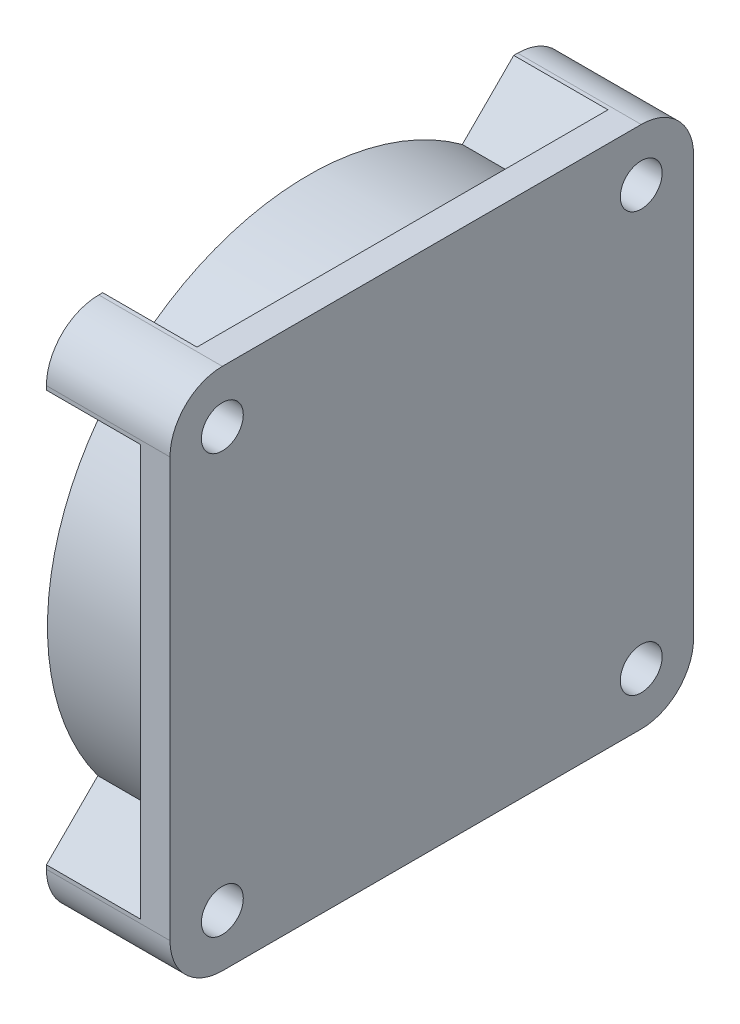
ISO-10303-21;
HEADER;
FILE_DESCRIPTION(('STEP AP214'),'2;1');
FILE_NAME('part.step','',(''),(''),'','','');
FILE_SCHEMA(('AUTOMOTIVE_DESIGN { 1 0 10303 214 1 1 1 1 }'));
ENDSEC;
DATA;
#1=APPLICATION_CONTEXT('core data for automotive mechanical design processes');
#2=APPLICATION_PROTOCOL_DEFINITION('international standard','automotive_design',2000,#1);
#3=PRODUCT_CONTEXT('',#1,'mechanical');
#4=PRODUCT('Part','Part','',(#3));
#5=PRODUCT_RELATED_PRODUCT_CATEGORY('part','',(#4));
#6=PRODUCT_DEFINITION_FORMATION('','',#4);
#7=PRODUCT_DEFINITION_CONTEXT('part definition',#1,'design');
#8=PRODUCT_DEFINITION('design','',#6,#7);
#9=PRODUCT_DEFINITION_SHAPE('','',#8);
#10=(LENGTH_UNIT() NAMED_UNIT(*) SI_UNIT(.MILLI.,.METRE.));
#11=(NAMED_UNIT(*) PLANE_ANGLE_UNIT() SI_UNIT($,.RADIAN.));
#12=(NAMED_UNIT(*) SI_UNIT($,.STERADIAN.) SOLID_ANGLE_UNIT());
#13=UNCERTAINTY_MEASURE_WITH_UNIT(LENGTH_MEASURE(1.E-05),#10,'distance_accuracy_value','');
#14=(GEOMETRIC_REPRESENTATION_CONTEXT(3) GLOBAL_UNCERTAINTY_ASSIGNED_CONTEXT((#13)) GLOBAL_UNIT_ASSIGNED_CONTEXT((#10,
#11,#12)) REPRESENTATION_CONTEXT('',''));
#15=CARTESIAN_POINT('',(0.,0.,0.));
#16=DIRECTION('',(0.,0.,1.));
#17=DIRECTION('',(1.,0.,0.));
#18=AXIS2_PLACEMENT_3D('',#15,#16,#17);
#19=CARTESIAN_POINT('',(11.8,-20.,20.));
#20=DIRECTION('',(-1.,0.,0.));
#21=DIRECTION('',(0.,0.,1.));
#22=AXIS2_PLACEMENT_3D('',#19,#20,#21);
#23=CYLINDRICAL_SURFACE('',#22,2.);
#24=CARTESIAN_POINT('',(11.8,-20.,20.));
#25=DIRECTION('',(1.,0.,0.));
#26=DIRECTION('',(0.,0.,-1.));
#27=AXIS2_PLACEMENT_3D('',#24,#25,#26);
#28=CIRCLE('',#27,2.);
#29=CARTESIAN_POINT('',(11.8,-20.,18.));
#30=VERTEX_POINT('',#29);
#31=EDGE_CURVE('E314',#30,#30,#28,.T.);
#32=ORIENTED_EDGE('',*,*,#31,.T.);
#33=EDGE_LOOP('',(#32));
#34=FACE_BOUND('',#33,.T.);
#35=CARTESIAN_POINT('',(1.5,-20.,20.));
#36=DIRECTION('',(-1.,0.,0.));
#37=DIRECTION('',(0.,0.,1.));
#38=AXIS2_PLACEMENT_3D('',#35,#36,#37);
#39=CIRCLE('',#38,2.);
#40=CARTESIAN_POINT('',(1.5,-20.,22.));
#41=VERTEX_POINT('',#40);
#42=EDGE_CURVE('E47',#41,#41,#39,.T.);
#43=ORIENTED_EDGE('',*,*,#42,.T.);
#44=EDGE_LOOP('',(#43));
#45=FACE_BOUND('',#44,.T.);
#46=ADVANCED_FACE('F43',(#34,#45),#23,.F.);
#47=CARTESIAN_POINT('',(11.8,20.0000000000001,19.9999999999999));
#48=DIRECTION('',(-1.,0.,0.));
#49=DIRECTION('',(0.,0.,1.));
#50=AXIS2_PLACEMENT_3D('',#47,#48,#49);
#51=CYLINDRICAL_SURFACE('',#50,2.00000000000001);
#52=CARTESIAN_POINT('',(11.8,20.0000000000001,19.9999999999999));
#53=DIRECTION('',(1.,0.,0.));
#54=DIRECTION('',(0.,0.,-1.));
#55=AXIS2_PLACEMENT_3D('',#52,#53,#54);
#56=CIRCLE('',#55,2.00000000000001);
#57=CARTESIAN_POINT('',(11.8,20.0000000000001,17.9999999999999));
#58=VERTEX_POINT('',#57);
#59=EDGE_CURVE('E306',#58,#58,#56,.T.);
#60=ORIENTED_EDGE('',*,*,#59,.T.);
#61=EDGE_LOOP('',(#60));
#62=FACE_BOUND('',#61,.T.);
#63=CARTESIAN_POINT('',(1.5,20.0000000000001,19.9999999999999));
#64=DIRECTION('',(-1.,0.,0.));
#65=DIRECTION('',(0.,0.,1.));
#66=AXIS2_PLACEMENT_3D('',#63,#64,#65);
#67=CIRCLE('',#66,2.00000000000001);
#68=CARTESIAN_POINT('',(1.5,20.0000000000001,21.9999999999999));
#69=VERTEX_POINT('',#68);
#70=EDGE_CURVE('E292',#69,#69,#67,.T.);
#71=ORIENTED_EDGE('',*,*,#70,.T.);
#72=EDGE_LOOP('',(#71));
#73=FACE_BOUND('',#72,.T.);
#74=ADVANCED_FACE('F439',(#62,#73),#51,.F.);
#75=CARTESIAN_POINT('',(11.8,19.9999999999999,-20.0000000000001));
#76=DIRECTION('',(-1.,0.,0.));
#77=DIRECTION('',(0.,0.,1.));
#78=AXIS2_PLACEMENT_3D('',#75,#76,#77);
#79=CYLINDRICAL_SURFACE('',#78,2.00000000000001);
#80=CARTESIAN_POINT('',(11.8,19.9999999999999,-20.0000000000001));
#81=DIRECTION('',(1.,0.,0.));
#82=DIRECTION('',(0.,0.,-1.));
#83=AXIS2_PLACEMENT_3D('',#80,#81,#82);
#84=CIRCLE('',#83,2.00000000000001);
#85=CARTESIAN_POINT('',(11.8,19.9999999999999,-22.0000000000002));
#86=VERTEX_POINT('',#85);
#87=EDGE_CURVE('E301',#86,#86,#84,.T.);
#88=ORIENTED_EDGE('',*,*,#87,.T.);
#89=EDGE_LOOP('',(#88));
#90=FACE_BOUND('',#89,.T.);
#91=CARTESIAN_POINT('',(1.5,19.9999999999999,-20.0000000000001));
#92=DIRECTION('',(-1.,0.,0.));
#93=DIRECTION('',(0.,0.,1.));
#94=AXIS2_PLACEMENT_3D('',#91,#92,#93);
#95=CIRCLE('',#94,2.00000000000001);
#96=CARTESIAN_POINT('',(1.5,19.9999999999999,-18.0000000000001));
#97=VERTEX_POINT('',#96);
#98=EDGE_CURVE('E289',#97,#97,#95,.T.);
#99=ORIENTED_EDGE('',*,*,#98,.T.);
#100=EDGE_LOOP('',(#99));
#101=FACE_BOUND('',#100,.T.);
#102=ADVANCED_FACE('F446',(#90,#101),#79,.F.);
#103=CARTESIAN_POINT('',(11.8,-20.0000000000002,-19.9999999999998));
#104=DIRECTION('',(-1.,0.,0.));
#105=DIRECTION('',(0.,0.,1.));
#106=AXIS2_PLACEMENT_3D('',#103,#104,#105);
#107=CYLINDRICAL_SURFACE('',#106,2.);
#108=CARTESIAN_POINT('',(11.8,-20.0000000000002,-19.9999999999998));
#109=DIRECTION('',(1.,0.,0.));
#110=DIRECTION('',(0.,0.,-1.));
#111=AXIS2_PLACEMENT_3D('',#108,#109,#110);
#112=CIRCLE('',#111,2.);
#113=CARTESIAN_POINT('',(11.8,-20.0000000000002,-21.9999999999998));
#114=VERTEX_POINT('',#113);
#115=EDGE_CURVE('E297',#114,#114,#112,.T.);
#116=ORIENTED_EDGE('',*,*,#115,.T.);
#117=EDGE_LOOP('',(#116));
#118=FACE_BOUND('',#117,.T.);
#119=CARTESIAN_POINT('',(1.5,-20.0000000000002,-19.9999999999998));
#120=DIRECTION('',(-1.,0.,0.));
#121=DIRECTION('',(0.,0.,1.));
#122=AXIS2_PLACEMENT_3D('',#119,#120,#121);
#123=CIRCLE('',#122,2.);
#124=CARTESIAN_POINT('',(1.5,-20.0000000000002,-17.9999999999998));
#125=VERTEX_POINT('',#124);
#126=EDGE_CURVE('E286',#125,#125,#123,.T.);
#127=ORIENTED_EDGE('',*,*,#126,.T.);
#128=EDGE_LOOP('',(#127));
#129=FACE_BOUND('',#128,.T.);
#130=ADVANCED_FACE('F435',(#118,#129),#107,.F.);
#131=CARTESIAN_POINT('',(11.8,0.,0.));
#132=DIRECTION('',(-1.,0.,0.));
#133=DIRECTION('',(0.,0.,1.));
#134=AXIS2_PLACEMENT_3D('',#131,#132,#133);
#135=PLANE('',#134);
#136=DIRECTION('',(0.,1.,0.));
#137=VECTOR('',#136,1.);
#138=CARTESIAN_POINT('',(11.8,-25.,-25.));
#139=LINE('',#138,#137);
#140=CARTESIAN_POINT('',(11.8,-20.,-25.));
#141=VERTEX_POINT('',#140);
#142=CARTESIAN_POINT('',(11.8,20.,-25.));
#143=VERTEX_POINT('',#142);
#144=EDGE_CURVE('E250',#141,#143,#139,.T.);
#145=ORIENTED_EDGE('',*,*,#144,.T.);
#146=CARTESIAN_POINT('',(11.8,20.,-20.));
#147=DIRECTION('',(-1.,0.,0.));
#148=DIRECTION('',(0.,0.,1.));
#149=AXIS2_PLACEMENT_3D('',#146,#147,#148);
#150=CIRCLE('',#149,5.);
#151=CARTESIAN_POINT('',(11.8,25.,-20.));
#152=VERTEX_POINT('',#151);
#153=EDGE_CURVE('E277',#143,#152,#150,.F.);
#154=ORIENTED_EDGE('',*,*,#153,.T.);
#155=DIRECTION('',(0.,0.,1.));
#156=VECTOR('',#155,1.);
#157=CARTESIAN_POINT('',(11.8,25.,25.));
#158=LINE('',#157,#156);
#159=CARTESIAN_POINT('',(11.8,25.,20.));
#160=VERTEX_POINT('',#159);
#161=EDGE_CURVE('E320',#152,#160,#158,.T.);
#162=ORIENTED_EDGE('',*,*,#161,.T.);
#163=CARTESIAN_POINT('',(11.8,20.,20.));
#164=DIRECTION('',(-1.,0.,0.));
#165=DIRECTION('',(0.,0.,1.));
#166=AXIS2_PLACEMENT_3D('',#163,#164,#165);
#167=CIRCLE('',#166,5.);
#168=CARTESIAN_POINT('',(11.8,20.,25.));
#169=VERTEX_POINT('',#168);
#170=EDGE_CURVE('E271',#160,#169,#167,.F.);
#171=ORIENTED_EDGE('',*,*,#170,.T.);
#172=DIRECTION('',(0.,-1.,0.));
#173=VECTOR('',#172,1.);
#174=CARTESIAN_POINT('',(11.8,-25.,25.));
#175=LINE('',#174,#173);
#176=CARTESIAN_POINT('',(11.8,-20.,25.));
#177=VERTEX_POINT('',#176);
#178=EDGE_CURVE('E323',#169,#177,#175,.T.);
#179=ORIENTED_EDGE('',*,*,#178,.T.);
#180=CARTESIAN_POINT('',(11.8,-20.,20.));
#181=DIRECTION('',(-1.,0.,0.));
#182=DIRECTION('',(0.,0.,1.));
#183=AXIS2_PLACEMENT_3D('',#180,#181,#182);
#184=CIRCLE('',#183,5.);
#185=CARTESIAN_POINT('',(11.8,-25.,20.));
#186=VERTEX_POINT('',#185);
#187=EDGE_CURVE('E273',#177,#186,#184,.F.);
#188=ORIENTED_EDGE('',*,*,#187,.T.);
#189=DIRECTION('',(0.,0.,-1.));
#190=VECTOR('',#189,1.);
#191=CARTESIAN_POINT('',(11.8,-25.,25.));
#192=LINE('',#191,#190);
#193=CARTESIAN_POINT('',(11.8,-25.,-20.));
#194=VERTEX_POINT('',#193);
#195=EDGE_CURVE('E253',#186,#194,#192,.T.);
#196=ORIENTED_EDGE('',*,*,#195,.T.);
#197=CARTESIAN_POINT('',(11.8,-20.,-20.));
#198=DIRECTION('',(-1.,0.,0.));
#199=DIRECTION('',(0.,0.,1.));
#200=AXIS2_PLACEMENT_3D('',#197,#198,#199);
#201=CIRCLE('',#200,5.);
#202=EDGE_CURVE('E275',#194,#141,#201,.F.);
#203=ORIENTED_EDGE('',*,*,#202,.T.);
#204=EDGE_LOOP('',(#145,#154,#162,#171,#179,#188,#196,#203));
#205=FACE_BOUND('',#204,.T.);
#206=ORIENTED_EDGE('',*,*,#31,.F.);
#207=EDGE_LOOP('',(#206));
#208=FACE_BOUND('',#207,.T.);
#209=ORIENTED_EDGE('',*,*,#59,.F.);
#210=EDGE_LOOP('',(#209));
#211=FACE_BOUND('',#210,.T.);
#212=ORIENTED_EDGE('',*,*,#87,.F.);
#213=EDGE_LOOP('',(#212));
#214=FACE_BOUND('',#213,.T.);
#215=ORIENTED_EDGE('',*,*,#115,.F.);
#216=EDGE_LOOP('',(#215));
#217=FACE_BOUND('',#216,.T.);
#218=ADVANCED_FACE('F329',(#205,#208,#211,#214,#217),#135,.F.);
#219=CARTESIAN_POINT('',(0.,0.,0.));
#220=DIRECTION('',(-1.,0.,0.));
#221=DIRECTION('',(0.,0.,1.));
#222=AXIS2_PLACEMENT_3D('',#219,#220,#221);
#223=PLANE('',#222);
#224=DIRECTION('',(0.,0.707106781186556,0.707106781186538));
#225=VECTOR('',#224,1.);
#226=CARTESIAN_POINT('',(0.,25.,19.6259884629817));
#227=LINE('',#226,#225);
#228=CARTESIAN_POINT('',(0.,20.0877241444842,14.7137126074661));
#229=VERTEX_POINT('',#228);
#230=CARTESIAN_POINT('',(0.,25.,19.6259884629817));
#231=VERTEX_POINT('',#230);
#232=EDGE_CURVE('E218',#229,#231,#227,.T.);
#233=ORIENTED_EDGE('',*,*,#232,.F.);
#234=CARTESIAN_POINT('',(0.,0.,0.));
#235=DIRECTION('',(1.,0.,0.));
#236=DIRECTION('',(0.,0.,1.));
#237=AXIS2_PLACEMENT_3D('',#234,#235,#236);
#238=CIRCLE('',#237,24.9);
#239=CARTESIAN_POINT('',(0.,20.0877241444839,-14.7137126074665));
#240=VERTEX_POINT('',#239);
#241=EDGE_CURVE('E228',#240,#229,#238,.T.);
#242=ORIENTED_EDGE('',*,*,#241,.F.);
#243=DIRECTION('',(0.,-0.70710678118654,0.707106781186555));
#244=VECTOR('',#243,1.);
#245=CARTESIAN_POINT('',(0.,25.,-19.6259884629828));
#246=LINE('',#245,#244);
#247=CARTESIAN_POINT('',(0.,25.,-19.6259884629828));
#248=VERTEX_POINT('',#247);
#249=EDGE_CURVE('E209',#248,#240,#246,.T.);
#250=ORIENTED_EDGE('',*,*,#249,.F.);
#251=DIRECTION('',(0.,0.,1.));
#252=VECTOR('',#251,1.);
#253=CARTESIAN_POINT('',(0.,25.,25.));
#254=LINE('',#253,#252);
#255=CARTESIAN_POINT('',(0.,25.,-20.));
#256=VERTEX_POINT('',#255);
#257=EDGE_CURVE('E226',#256,#248,#254,.T.);
#258=ORIENTED_EDGE('',*,*,#257,.F.);
#259=CARTESIAN_POINT('',(0.,20.,-20.));
#260=DIRECTION('',(-1.,0.,0.));
#261=DIRECTION('',(0.,0.,1.));
#262=AXIS2_PLACEMENT_3D('',#259,#260,#261);
#263=CIRCLE('',#262,5.);
#264=CARTESIAN_POINT('',(0.,20.,-25.));
#265=VERTEX_POINT('',#264);
#266=EDGE_CURVE('E264',#256,#265,#263,.T.);
#267=ORIENTED_EDGE('',*,*,#266,.T.);
#268=DIRECTION('',(0.,1.,0.));
#269=VECTOR('',#268,1.);
#270=CARTESIAN_POINT('',(0.,-25.,-25.));
#271=LINE('',#270,#269);
#272=CARTESIAN_POINT('',(0.,19.6259884629817,-25.));
#273=VERTEX_POINT('',#272);
#274=EDGE_CURVE('E317',#273,#265,#271,.T.);
#275=ORIENTED_EDGE('',*,*,#274,.F.);
#276=DIRECTION('',(0.,0.707106781186539,-0.707106781186556));
#277=VECTOR('',#276,1.);
#278=CARTESIAN_POINT('',(0.,19.6259884629817,-25.));
#279=LINE('',#278,#277);
#280=CARTESIAN_POINT('',(0.,14.7137126074661,-20.0877241444842));
#281=VERTEX_POINT('',#280);
#282=EDGE_CURVE('E566',#281,#273,#279,.T.);
#283=ORIENTED_EDGE('',*,*,#282,.F.);
#284=CARTESIAN_POINT('',(0.,0.,0.));
#285=DIRECTION('',(1.,0.,0.));
#286=DIRECTION('',(0.,0.,1.));
#287=AXIS2_PLACEMENT_3D('',#284,#285,#286);
#288=CIRCLE('',#287,24.9);
#289=CARTESIAN_POINT('',(0.,-14.7137126074665,-20.0877241444839));
#290=VERTEX_POINT('',#289);
#291=EDGE_CURVE('E574',#290,#281,#288,.T.);
#292=ORIENTED_EDGE('',*,*,#291,.F.);
#293=DIRECTION('',(0.,0.707106781186556,0.707106781186539));
#294=VECTOR('',#293,1.);
#295=CARTESIAN_POINT('',(0.,-19.6259884629828,-25.));
#296=LINE('',#295,#294);
#297=CARTESIAN_POINT('',(0.,-19.6259884629828,-25.));
#298=VERTEX_POINT('',#297);
#299=EDGE_CURVE('E229',#298,#290,#296,.T.);
#300=ORIENTED_EDGE('',*,*,#299,.F.);
#301=CARTESIAN_POINT('',(0.,-20.,-25.));
#302=VERTEX_POINT('',#301);
#303=EDGE_CURVE('E241',#302,#298,#271,.T.);
#304=ORIENTED_EDGE('',*,*,#303,.F.);
#305=CARTESIAN_POINT('',(0.,-20.,-20.));
#306=DIRECTION('',(-1.,0.,0.));
#307=DIRECTION('',(0.,0.,1.));
#308=AXIS2_PLACEMENT_3D('',#305,#306,#307);
#309=CIRCLE('',#308,5.);
#310=CARTESIAN_POINT('',(0.,-25.,-20.));
#311=VERTEX_POINT('',#310);
#312=EDGE_CURVE('E261',#302,#311,#309,.T.);
#313=ORIENTED_EDGE('',*,*,#312,.T.);
#314=DIRECTION('',(0.,0.,-1.));
#315=VECTOR('',#314,1.);
#316=CARTESIAN_POINT('',(0.,-25.,25.));
#317=LINE('',#316,#315);
#318=CARTESIAN_POINT('',(0.,-25.,-19.6259884629817));
#319=VERTEX_POINT('',#318);
#320=EDGE_CURVE('E246',#319,#311,#317,.T.);
#321=ORIENTED_EDGE('',*,*,#320,.F.);
#322=DIRECTION('',(0.,-0.707106781186556,-0.70710678118654));
#323=VECTOR('',#322,1.);
#324=CARTESIAN_POINT('',(0.,-25.,-19.6259884629817));
#325=LINE('',#324,#323);
#326=CARTESIAN_POINT('',(0.,-20.0877241444842,-14.7137126074661));
#327=VERTEX_POINT('',#326);
#328=EDGE_CURVE('E382',#327,#319,#325,.T.);
#329=ORIENTED_EDGE('',*,*,#328,.F.);
#330=CARTESIAN_POINT('',(0.,0.,0.));
#331=DIRECTION('',(1.,0.,0.));
#332=DIRECTION('',(0.,0.,1.));
#333=AXIS2_PLACEMENT_3D('',#330,#331,#332);
#334=CIRCLE('',#333,24.9);
#335=CARTESIAN_POINT('',(0.,-20.0877241444839,14.7137126074665));
#336=VERTEX_POINT('',#335);
#337=EDGE_CURVE('E379',#336,#327,#334,.T.);
#338=ORIENTED_EDGE('',*,*,#337,.F.);
#339=DIRECTION('',(0.,0.70710678118654,-0.707106781186555));
#340=VECTOR('',#339,1.);
#341=CARTESIAN_POINT('',(0.,-25.,19.6259884629828));
#342=LINE('',#341,#340);
#343=CARTESIAN_POINT('',(0.,-25.,19.6259884629828));
#344=VERTEX_POINT('',#343);
#345=EDGE_CURVE('E376',#344,#336,#342,.T.);
#346=ORIENTED_EDGE('',*,*,#345,.F.);
#347=CARTESIAN_POINT('',(0.,-25.,20.));
#348=VERTEX_POINT('',#347);
#349=EDGE_CURVE('E247',#348,#344,#317,.T.);
#350=ORIENTED_EDGE('',*,*,#349,.F.);
#351=CARTESIAN_POINT('',(0.,-20.,20.));
#352=DIRECTION('',(-1.,0.,0.));
#353=DIRECTION('',(0.,0.,1.));
#354=AXIS2_PLACEMENT_3D('',#351,#352,#353);
#355=CIRCLE('',#354,5.);
#356=CARTESIAN_POINT('',(0.,-20.,25.));
#357=VERTEX_POINT('',#356);
#358=EDGE_CURVE('E258',#348,#357,#355,.T.);
#359=ORIENTED_EDGE('',*,*,#358,.T.);
#360=DIRECTION('',(0.,-1.,0.));
#361=VECTOR('',#360,1.);
#362=CARTESIAN_POINT('',(0.,-25.,25.));
#363=LINE('',#362,#361);
#364=CARTESIAN_POINT('',(0.,-19.6259884629817,25.));
#365=VERTEX_POINT('',#364);
#366=EDGE_CURVE('E236',#365,#357,#363,.T.);
#367=ORIENTED_EDGE('',*,*,#366,.F.);
#368=DIRECTION('',(0.,-0.707106781186539,0.707106781186556));
#369=VECTOR('',#368,1.);
#370=CARTESIAN_POINT('',(0.,-19.6259884629817,25.));
#371=LINE('',#370,#369);
#372=CARTESIAN_POINT('',(0.,-14.7137126074661,20.0877241444842));
#373=VERTEX_POINT('',#372);
#374=EDGE_CURVE('E586',#373,#365,#371,.T.);
#375=ORIENTED_EDGE('',*,*,#374,.F.);
#376=CARTESIAN_POINT('',(0.,0.,0.));
#377=DIRECTION('',(1.,0.,0.));
#378=DIRECTION('',(0.,0.,1.));
#379=AXIS2_PLACEMENT_3D('',#376,#377,#378);
#380=CIRCLE('',#379,24.9);
#381=CARTESIAN_POINT('',(0.,14.7137126074665,20.0877241444839));
#382=VERTEX_POINT('',#381);
#383=EDGE_CURVE('E595',#382,#373,#380,.T.);
#384=ORIENTED_EDGE('',*,*,#383,.F.);
#385=DIRECTION('',(0.,-0.707106781186555,-0.70710678118654));
#386=VECTOR('',#385,1.);
#387=CARTESIAN_POINT('',(0.,19.6259884629828,25.));
#388=LINE('',#387,#386);
#389=CARTESIAN_POINT('',(0.,19.6259884629828,25.));
#390=VERTEX_POINT('',#389);
#391=EDGE_CURVE('E563',#390,#382,#388,.T.);
#392=ORIENTED_EDGE('',*,*,#391,.F.);
#393=CARTESIAN_POINT('',(0.,20.,25.));
#394=VERTEX_POINT('',#393);
#395=EDGE_CURVE('E239',#394,#390,#363,.T.);
#396=ORIENTED_EDGE('',*,*,#395,.F.);
#397=CARTESIAN_POINT('',(0.,20.,20.));
#398=DIRECTION('',(-1.,0.,0.));
#399=DIRECTION('',(0.,0.,1.));
#400=AXIS2_PLACEMENT_3D('',#397,#398,#399);
#401=CIRCLE('',#400,5.);
#402=CARTESIAN_POINT('',(0.,25.,20.));
#403=VERTEX_POINT('',#402);
#404=EDGE_CURVE('E255',#394,#403,#401,.T.);
#405=ORIENTED_EDGE('',*,*,#404,.T.);
#406=EDGE_CURVE('E237',#231,#403,#254,.T.);
#407=ORIENTED_EDGE('',*,*,#406,.F.);
#408=EDGE_LOOP('',(#233,#242,#250,#258,#267,#275,#283,#292,#300,#304,#313,#321,#329,#338,#346,
#350,#359,#367,#375,#384,#392,#396,#405,#407));
#409=FACE_BOUND('',#408,.T.);
#410=CARTESIAN_POINT('',(0.,-20.,20.));
#411=DIRECTION('',(-1.,0.,0.));
#412=DIRECTION('',(0.,0.,1.));
#413=AXIS2_PLACEMENT_3D('',#410,#411,#412);
#414=CIRCLE('',#413,3.05);
#415=CARTESIAN_POINT('',(0.,-20.,23.05));
#416=VERTEX_POINT('',#415);
#417=EDGE_CURVE('E414',#416,#416,#414,.T.);
#418=ORIENTED_EDGE('',*,*,#417,.F.);
#419=EDGE_LOOP('',(#418));
#420=FACE_BOUND('',#419,.T.);
#421=CARTESIAN_POINT('',(0.,20.0000000000001,19.9999999999999));
#422=DIRECTION('',(-1.,0.,0.));
#423=DIRECTION('',(0.,0.,1.));
#424=AXIS2_PLACEMENT_3D('',#421,#422,#423);
#425=CIRCLE('',#424,3.05);
#426=CARTESIAN_POINT('',(0.,20.0000000000001,23.0499999999999));
#427=VERTEX_POINT('',#426);
#428=EDGE_CURVE('E408',#427,#427,#425,.T.);
#429=ORIENTED_EDGE('',*,*,#428,.F.);
#430=EDGE_LOOP('',(#429));
#431=FACE_BOUND('',#430,.T.);
#432=CARTESIAN_POINT('',(0.,19.9999999999998,-20.0000000000002));
#433=DIRECTION('',(-1.,0.,0.));
#434=DIRECTION('',(0.,0.,1.));
#435=AXIS2_PLACEMENT_3D('',#432,#433,#434);
#436=CIRCLE('',#435,3.05000000000001);
#437=CARTESIAN_POINT('',(0.,19.9999999999998,-16.9500000000001));
#438=VERTEX_POINT('',#437);
#439=EDGE_CURVE('E402',#438,#438,#436,.T.);
#440=ORIENTED_EDGE('',*,*,#439,.F.);
#441=EDGE_LOOP('',(#440));
#442=FACE_BOUND('',#441,.T.);
#443=CARTESIAN_POINT('',(0.,-20.0000000000002,-19.9999999999998));
#444=DIRECTION('',(-1.,0.,0.));
#445=DIRECTION('',(0.,0.,1.));
#446=AXIS2_PLACEMENT_3D('',#443,#444,#445);
#447=CIRCLE('',#446,3.05);
#448=CARTESIAN_POINT('',(0.,-20.0000000000002,-16.9499999999998));
#449=VERTEX_POINT('',#448);
#450=EDGE_CURVE('E309',#449,#449,#447,.T.);
#451=ORIENTED_EDGE('',*,*,#450,.F.);
#452=EDGE_LOOP('',(#451));
#453=FACE_BOUND('',#452,.T.);
#454=ADVANCED_FACE('F223',(#409,#420,#431,#442,#453),#223,.T.);
#455=CARTESIAN_POINT('',(11.8,-25.,-25.));
#456=DIRECTION('',(0.,0.,1.));
#457=DIRECTION('',(1.,0.,0.));
#458=AXIS2_PLACEMENT_3D('',#455,#456,#457);
#459=PLANE('',#458);
#460=DIRECTION('',(0.,1.,0.));
#461=VECTOR('',#460,1.);
#462=CARTESIAN_POINT('',(9.,-19.6259884629828,-25.));
#463=LINE('',#462,#461);
#464=CARTESIAN_POINT('',(9.,-19.6259884629828,-25.));
#465=VERTEX_POINT('',#464);
#466=CARTESIAN_POINT('',(9.,19.6259884629817,-25.));
#467=VERTEX_POINT('',#466);
#468=EDGE_CURVE('E562',#465,#467,#463,.T.);
#469=ORIENTED_EDGE('',*,*,#468,.T.);
#470=DIRECTION('',(-1.,0.,0.));
#471=VECTOR('',#470,1.);
#472=CARTESIAN_POINT('',(51.3581615684695,19.6259884629817,-25.));
#473=LINE('',#472,#471);
#474=EDGE_CURVE('E60',#467,#273,#473,.T.);
#475=ORIENTED_EDGE('',*,*,#474,.T.);
#476=ORIENTED_EDGE('',*,*,#274,.T.);
#477=DIRECTION('',(-1.,0.,0.));
#478=VECTOR('',#477,1.);
#479=CARTESIAN_POINT('',(11.8,20.,-25.));
#480=LINE('',#479,#478);
#481=EDGE_CURVE('E269',#265,#143,#480,.F.);
#482=ORIENTED_EDGE('',*,*,#481,.T.);
#483=ORIENTED_EDGE('',*,*,#144,.F.);
#484=DIRECTION('',(-1.,0.,0.));
#485=VECTOR('',#484,1.);
#486=CARTESIAN_POINT('',(11.8,-20.,-25.));
#487=LINE('',#486,#485);
#488=EDGE_CURVE('E266',#141,#302,#487,.T.);
#489=ORIENTED_EDGE('',*,*,#488,.T.);
#490=ORIENTED_EDGE('',*,*,#303,.T.);
#491=DIRECTION('',(-1.,0.,0.));
#492=VECTOR('',#491,1.);
#493=CARTESIAN_POINT('',(51.3581615684695,-19.6259884629828,-25.));
#494=LINE('',#493,#492);
#495=EDGE_CURVE('E564',#465,#298,#494,.T.);
#496=ORIENTED_EDGE('',*,*,#495,.F.);
#497=EDGE_LOOP('',(#469,#475,#476,#482,#483,#489,#490,#496));
#498=FACE_BOUND('',#497,.T.);
#499=ADVANCED_FACE('F343',(#498),#459,.F.);
#500=CARTESIAN_POINT('',(11.8,25.,25.));
#501=DIRECTION('',(0.,-1.,0.));
#502=DIRECTION('',(0.,0.,-1.));
#503=AXIS2_PLACEMENT_3D('',#500,#501,#502);
#504=PLANE('',#503);
#505=DIRECTION('',(0.,0.,1.));
#506=VECTOR('',#505,1.);
#507=CARTESIAN_POINT('',(9.,25.,-19.6259884629828));
#508=LINE('',#507,#506);
#509=CARTESIAN_POINT('',(9.,25.,-19.6259884629828));
#510=VERTEX_POINT('',#509);
#511=CARTESIAN_POINT('',(9.,25.,19.6259884629817));
#512=VERTEX_POINT('',#511);
#513=EDGE_CURVE('E545',#510,#512,#508,.T.);
#514=ORIENTED_EDGE('',*,*,#513,.T.);
#515=DIRECTION('',(-1.,0.,0.));
#516=VECTOR('',#515,1.);
#517=CARTESIAN_POINT('',(51.3581615684695,25.,19.6259884629817));
#518=LINE('',#517,#516);
#519=EDGE_CURVE('E68',#512,#231,#518,.T.);
#520=ORIENTED_EDGE('',*,*,#519,.T.);
#521=ORIENTED_EDGE('',*,*,#406,.T.);
#522=DIRECTION('',(-1.,0.,0.));
#523=VECTOR('',#522,1.);
#524=CARTESIAN_POINT('',(11.8,25.,20.));
#525=LINE('',#524,#523);
#526=EDGE_CURVE('E251',#403,#160,#525,.F.);
#527=ORIENTED_EDGE('',*,*,#526,.T.);
#528=ORIENTED_EDGE('',*,*,#161,.F.);
#529=DIRECTION('',(-1.,0.,0.));
#530=VECTOR('',#529,1.);
#531=CARTESIAN_POINT('',(11.8,25.,-20.));
#532=LINE('',#531,#530);
#533=EDGE_CURVE('E235',#152,#256,#532,.T.);
#534=ORIENTED_EDGE('',*,*,#533,.T.);
#535=ORIENTED_EDGE('',*,*,#257,.T.);
#536=DIRECTION('',(-1.,0.,0.));
#537=VECTOR('',#536,1.);
#538=CARTESIAN_POINT('',(51.3581615684695,25.,-19.6259884629828));
#539=LINE('',#538,#537);
#540=EDGE_CURVE('E205',#510,#248,#539,.T.);
#541=ORIENTED_EDGE('',*,*,#540,.F.);
#542=EDGE_LOOP('',(#514,#520,#521,#527,#528,#534,#535,#541));
#543=FACE_BOUND('',#542,.T.);
#544=ADVANCED_FACE('F232',(#543),#504,.F.);
#545=CARTESIAN_POINT('',(11.8,-25.,25.));
#546=DIRECTION('',(0.,0.,-1.));
#547=DIRECTION('',(-1.,0.,0.));
#548=AXIS2_PLACEMENT_3D('',#545,#546,#547);
#549=PLANE('',#548);
#550=DIRECTION('',(0.,-1.,0.));
#551=VECTOR('',#550,1.);
#552=CARTESIAN_POINT('',(9.,19.6259884629828,25.));
#553=LINE('',#552,#551);
#554=CARTESIAN_POINT('',(9.,19.6259884629828,25.));
#555=VERTEX_POINT('',#554);
#556=CARTESIAN_POINT('',(9.,-19.6259884629817,25.));
#557=VERTEX_POINT('',#556);
#558=EDGE_CURVE('E583',#555,#557,#553,.T.);
#559=ORIENTED_EDGE('',*,*,#558,.T.);
#560=DIRECTION('',(-1.,0.,0.));
#561=VECTOR('',#560,1.);
#562=CARTESIAN_POINT('',(51.3581615684695,-19.6259884629817,25.));
#563=LINE('',#562,#561);
#564=EDGE_CURVE('E591',#557,#365,#563,.T.);
#565=ORIENTED_EDGE('',*,*,#564,.T.);
#566=ORIENTED_EDGE('',*,*,#366,.T.);
#567=DIRECTION('',(-1.,0.,0.));
#568=VECTOR('',#567,1.);
#569=CARTESIAN_POINT('',(11.8,-20.,25.));
#570=LINE('',#569,#568);
#571=EDGE_CURVE('E12',#357,#177,#570,.F.);
#572=ORIENTED_EDGE('',*,*,#571,.T.);
#573=ORIENTED_EDGE('',*,*,#178,.F.);
#574=DIRECTION('',(-1.,0.,0.));
#575=VECTOR('',#574,1.);
#576=CARTESIAN_POINT('',(11.8,20.,25.));
#577=LINE('',#576,#575);
#578=EDGE_CURVE('E52',#169,#394,#577,.T.);
#579=ORIENTED_EDGE('',*,*,#578,.T.);
#580=ORIENTED_EDGE('',*,*,#395,.T.);
#581=DIRECTION('',(-1.,0.,0.));
#582=VECTOR('',#581,1.);
#583=CARTESIAN_POINT('',(51.3581615684695,19.6259884629828,25.));
#584=LINE('',#583,#582);
#585=EDGE_CURVE('E584',#555,#390,#584,.T.);
#586=ORIENTED_EDGE('',*,*,#585,.F.);
#587=EDGE_LOOP('',(#559,#565,#566,#572,#573,#579,#580,#586));
#588=FACE_BOUND('',#587,.T.);
#589=ADVANCED_FACE('F363',(#588),#549,.F.);
#590=CARTESIAN_POINT('',(11.8,-25.,25.));
#591=DIRECTION('',(0.,1.,0.));
#592=DIRECTION('',(0.,0.,1.));
#593=AXIS2_PLACEMENT_3D('',#590,#591,#592);
#594=PLANE('',#593);
#595=ORIENTED_EDGE('',*,*,#349,.T.);
#596=DIRECTION('',(-1.,0.,0.));
#597=VECTOR('',#596,1.);
#598=CARTESIAN_POINT('',(51.3581615684695,-25.,19.6259884629828));
#599=LINE('',#598,#597);
#600=CARTESIAN_POINT('',(9.,-25.,19.6259884629828));
#601=VERTEX_POINT('',#600);
#602=EDGE_CURVE('E606',#601,#344,#599,.T.);
#603=ORIENTED_EDGE('',*,*,#602,.F.);
#604=DIRECTION('',(0.,0.,-1.));
#605=VECTOR('',#604,1.);
#606=CARTESIAN_POINT('',(9.,-25.,19.6259884629828));
#607=LINE('',#606,#605);
#608=CARTESIAN_POINT('',(9.,-25.,-19.6259884629817));
#609=VERTEX_POINT('',#608);
#610=EDGE_CURVE('E399',#601,#609,#607,.T.);
#611=ORIENTED_EDGE('',*,*,#610,.T.);
#612=DIRECTION('',(-1.,0.,0.));
#613=VECTOR('',#612,1.);
#614=CARTESIAN_POINT('',(51.3581615684695,-25.,-19.6259884629817));
#615=LINE('',#614,#613);
#616=EDGE_CURVE('E386',#609,#319,#615,.T.);
#617=ORIENTED_EDGE('',*,*,#616,.T.);
#618=ORIENTED_EDGE('',*,*,#320,.T.);
#619=DIRECTION('',(-1.,0.,0.));
#620=VECTOR('',#619,1.);
#621=CARTESIAN_POINT('',(11.8,-25.,-20.));
#622=LINE('',#621,#620);
#623=EDGE_CURVE('E282',#311,#194,#622,.F.);
#624=ORIENTED_EDGE('',*,*,#623,.T.);
#625=ORIENTED_EDGE('',*,*,#195,.F.);
#626=DIRECTION('',(-1.,0.,0.));
#627=VECTOR('',#626,1.);
#628=CARTESIAN_POINT('',(11.8,-25.,20.));
#629=LINE('',#628,#627);
#630=EDGE_CURVE('E279',#186,#348,#629,.T.);
#631=ORIENTED_EDGE('',*,*,#630,.T.);
#632=EDGE_LOOP('',(#595,#603,#611,#617,#618,#624,#625,#631));
#633=FACE_BOUND('',#632,.T.);
#634=ADVANCED_FACE('F371',(#633),#594,.F.);
#635=CARTESIAN_POINT('',(11.8,20.,-20.));
#636=DIRECTION('',(-1.,0.,0.));
#637=DIRECTION('',(0.,0.,1.));
#638=AXIS2_PLACEMENT_3D('',#635,#636,#637);
#639=CYLINDRICAL_SURFACE('',#638,5.);
#640=ORIENTED_EDGE('',*,*,#153,.F.);
#641=ORIENTED_EDGE('',*,*,#481,.F.);
#642=ORIENTED_EDGE('',*,*,#266,.F.);
#643=ORIENTED_EDGE('',*,*,#533,.F.);
#644=EDGE_LOOP('',(#640,#641,#642,#643));
#645=FACE_BOUND('',#644,.T.);
#646=ADVANCED_FACE('F354',(#645),#639,.T.);
#647=CARTESIAN_POINT('',(11.8,-20.,-20.));
#648=DIRECTION('',(-1.,0.,0.));
#649=DIRECTION('',(0.,0.,1.));
#650=AXIS2_PLACEMENT_3D('',#647,#648,#649);
#651=CYLINDRICAL_SURFACE('',#650,5.);
#652=ORIENTED_EDGE('',*,*,#202,.F.);
#653=ORIENTED_EDGE('',*,*,#623,.F.);
#654=ORIENTED_EDGE('',*,*,#312,.F.);
#655=ORIENTED_EDGE('',*,*,#488,.F.);
#656=EDGE_LOOP('',(#652,#653,#654,#655));
#657=FACE_BOUND('',#656,.T.);
#658=ADVANCED_FACE('F338',(#657),#651,.T.);
#659=CARTESIAN_POINT('',(11.8,-20.,20.));
#660=DIRECTION('',(-1.,0.,0.));
#661=DIRECTION('',(0.,0.,1.));
#662=AXIS2_PLACEMENT_3D('',#659,#660,#661);
#663=CYLINDRICAL_SURFACE('',#662,5.);
#664=ORIENTED_EDGE('',*,*,#187,.F.);
#665=ORIENTED_EDGE('',*,*,#571,.F.);
#666=ORIENTED_EDGE('',*,*,#358,.F.);
#667=ORIENTED_EDGE('',*,*,#630,.F.);
#668=EDGE_LOOP('',(#664,#665,#666,#667));
#669=FACE_BOUND('',#668,.T.);
#670=ADVANCED_FACE('F369',(#669),#663,.T.);
#671=CARTESIAN_POINT('',(11.8,20.,20.));
#672=DIRECTION('',(-1.,0.,0.));
#673=DIRECTION('',(0.,0.,1.));
#674=AXIS2_PLACEMENT_3D('',#671,#672,#673);
#675=CYLINDRICAL_SURFACE('',#674,5.);
#676=ORIENTED_EDGE('',*,*,#170,.F.);
#677=ORIENTED_EDGE('',*,*,#526,.F.);
#678=ORIENTED_EDGE('',*,*,#404,.F.);
#679=ORIENTED_EDGE('',*,*,#578,.F.);
#680=EDGE_LOOP('',(#676,#677,#678,#679));
#681=FACE_BOUND('',#680,.T.);
#682=ADVANCED_FACE('F45',(#681),#675,.T.);
#683=CARTESIAN_POINT('',(1.5,-20.0000000000002,-19.9999999999998));
#684=DIRECTION('',(-1.,0.,0.));
#685=DIRECTION('',(0.,0.,1.));
#686=AXIS2_PLACEMENT_3D('',#683,#684,#685);
#687=CYLINDRICAL_SURFACE('',#686,3.05);
#688=CARTESIAN_POINT('',(1.5,-20.0000000000002,-19.9999999999998));
#689=DIRECTION('',(-1.,0.,0.));
#690=DIRECTION('',(0.,0.,1.));
#691=AXIS2_PLACEMENT_3D('',#688,#689,#690);
#692=CIRCLE('',#691,3.05);
#693=CARTESIAN_POINT('',(1.5,-20.0000000000002,-16.9499999999998));
#694=VERTEX_POINT('',#693);
#695=EDGE_CURVE('E290',#694,#694,#692,.T.);
#696=ORIENTED_EDGE('',*,*,#695,.F.);
#697=EDGE_LOOP('',(#696));
#698=FACE_BOUND('',#697,.T.);
#699=ORIENTED_EDGE('',*,*,#450,.T.);
#700=EDGE_LOOP('',(#699));
#701=FACE_BOUND('',#700,.T.);
#702=ADVANCED_FACE('F425',(#698,#701),#687,.F.);
#703=CARTESIAN_POINT('',(1.5,-20.0000000000002,-19.9999999999998));
#704=DIRECTION('',(-1.,0.,0.));
#705=DIRECTION('',(0.,0.,1.));
#706=AXIS2_PLACEMENT_3D('',#703,#704,#705);
#707=PLANE('',#706);
#708=ORIENTED_EDGE('',*,*,#126,.F.);
#709=EDGE_LOOP('',(#708));
#710=FACE_BOUND('',#709,.T.);
#711=ORIENTED_EDGE('',*,*,#695,.T.);
#712=EDGE_LOOP('',(#711));
#713=FACE_BOUND('',#712,.T.);
#714=ADVANCED_FACE('F457',(#710,#713),#707,.T.);
#715=CARTESIAN_POINT('',(1.5,19.9999999999998,-20.0000000000002));
#716=DIRECTION('',(-1.,0.,0.));
#717=DIRECTION('',(0.,0.,1.));
#718=AXIS2_PLACEMENT_3D('',#715,#716,#717);
#719=CYLINDRICAL_SURFACE('',#718,3.05000000000001);
#720=CARTESIAN_POINT('',(1.5,19.9999999999998,-20.0000000000002));
#721=DIRECTION('',(-1.,0.,0.));
#722=DIRECTION('',(0.,0.,1.));
#723=AXIS2_PLACEMENT_3D('',#720,#721,#722);
#724=CIRCLE('',#723,3.05000000000001);
#725=CARTESIAN_POINT('',(1.5,19.9999999999998,-16.9500000000001));
#726=VERTEX_POINT('',#725);
#727=EDGE_CURVE('E405',#726,#726,#724,.T.);
#728=ORIENTED_EDGE('',*,*,#727,.F.);
#729=EDGE_LOOP('',(#728));
#730=FACE_BOUND('',#729,.T.);
#731=ORIENTED_EDGE('',*,*,#439,.T.);
#732=EDGE_LOOP('',(#731));
#733=FACE_BOUND('',#732,.T.);
#734=ADVANCED_FACE('F461',(#730,#733),#719,.F.);
#735=CARTESIAN_POINT('',(1.5,19.9999999999998,-20.0000000000002));
#736=DIRECTION('',(-1.,0.,0.));
#737=DIRECTION('',(0.,0.,1.));
#738=AXIS2_PLACEMENT_3D('',#735,#736,#737);
#739=PLANE('',#738);
#740=ORIENTED_EDGE('',*,*,#98,.F.);
#741=EDGE_LOOP('',(#740));
#742=FACE_BOUND('',#741,.T.);
#743=ORIENTED_EDGE('',*,*,#727,.T.);
#744=EDGE_LOOP('',(#743));
#745=FACE_BOUND('',#744,.T.);
#746=ADVANCED_FACE('F478',(#742,#745),#739,.T.);
#747=CARTESIAN_POINT('',(1.5,20.0000000000001,19.9999999999999));
#748=DIRECTION('',(-1.,0.,0.));
#749=DIRECTION('',(0.,0.,1.));
#750=AXIS2_PLACEMENT_3D('',#747,#748,#749);
#751=CYLINDRICAL_SURFACE('',#750,3.05);
#752=CARTESIAN_POINT('',(1.5,20.0000000000001,19.9999999999999));
#753=DIRECTION('',(-1.,0.,0.));
#754=DIRECTION('',(0.,0.,1.));
#755=AXIS2_PLACEMENT_3D('',#752,#753,#754);
#756=CIRCLE('',#755,3.05);
#757=CARTESIAN_POINT('',(1.5,20.0000000000001,23.0499999999999));
#758=VERTEX_POINT('',#757);
#759=EDGE_CURVE('E411',#758,#758,#756,.T.);
#760=ORIENTED_EDGE('',*,*,#759,.F.);
#761=EDGE_LOOP('',(#760));
#762=FACE_BOUND('',#761,.T.);
#763=ORIENTED_EDGE('',*,*,#428,.T.);
#764=EDGE_LOOP('',(#763));
#765=FACE_BOUND('',#764,.T.);
#766=ADVANCED_FACE('F474',(#762,#765),#751,.F.);
#767=CARTESIAN_POINT('',(1.5,20.0000000000001,19.9999999999999));
#768=DIRECTION('',(-1.,0.,0.));
#769=DIRECTION('',(0.,0.,1.));
#770=AXIS2_PLACEMENT_3D('',#767,#768,#769);
#771=PLANE('',#770);
#772=ORIENTED_EDGE('',*,*,#70,.F.);
#773=EDGE_LOOP('',(#772));
#774=FACE_BOUND('',#773,.T.);
#775=ORIENTED_EDGE('',*,*,#759,.T.);
#776=EDGE_LOOP('',(#775));
#777=FACE_BOUND('',#776,.T.);
#778=ADVANCED_FACE('F470',(#774,#777),#771,.T.);
#779=CARTESIAN_POINT('',(1.5,-20.,20.));
#780=DIRECTION('',(-1.,0.,0.));
#781=DIRECTION('',(0.,0.,1.));
#782=AXIS2_PLACEMENT_3D('',#779,#780,#781);
#783=CYLINDRICAL_SURFACE('',#782,3.05);
#784=CARTESIAN_POINT('',(1.5,-20.,20.));
#785=DIRECTION('',(-1.,0.,0.));
#786=DIRECTION('',(0.,0.,1.));
#787=AXIS2_PLACEMENT_3D('',#784,#785,#786);
#788=CIRCLE('',#787,3.05);
#789=CARTESIAN_POINT('',(1.5,-20.,23.05));
#790=VERTEX_POINT('',#789);
#791=EDGE_CURVE('E417',#790,#790,#788,.T.);
#792=ORIENTED_EDGE('',*,*,#791,.F.);
#793=EDGE_LOOP('',(#792));
#794=FACE_BOUND('',#793,.T.);
#795=ORIENTED_EDGE('',*,*,#417,.T.);
#796=EDGE_LOOP('',(#795));
#797=FACE_BOUND('',#796,.T.);
#798=ADVANCED_FACE('F466',(#794,#797),#783,.F.);
#799=CARTESIAN_POINT('',(1.5,-20.,20.));
#800=DIRECTION('',(-1.,0.,0.));
#801=DIRECTION('',(0.,0.,1.));
#802=AXIS2_PLACEMENT_3D('',#799,#800,#801);
#803=PLANE('',#802);
#804=ORIENTED_EDGE('',*,*,#42,.F.);
#805=EDGE_LOOP('',(#804));
#806=FACE_BOUND('',#805,.T.);
#807=ORIENTED_EDGE('',*,*,#791,.T.);
#808=EDGE_LOOP('',(#807));
#809=FACE_BOUND('',#808,.T.);
#810=ADVANCED_FACE('F463',(#806,#809),#803,.T.);
#811=CARTESIAN_POINT('',(51.3581615684695,0.,0.));
#812=DIRECTION('',(-1.,0.,0.));
#813=DIRECTION('',(0.,0.,1.));
#814=AXIS2_PLACEMENT_3D('',#811,#812,#813);
#815=CYLINDRICAL_SURFACE('',#814,24.9);
#816=CARTESIAN_POINT('',(9.,0.,0.));
#817=DIRECTION('',(-1.,0.,0.));
#818=DIRECTION('',(0.,0.,1.));
#819=AXIS2_PLACEMENT_3D('',#816,#817,#818);
#820=CIRCLE('',#819,24.9);
#821=CARTESIAN_POINT('',(9.,-20.0877241444842,-14.7137126074661));
#822=VERTEX_POINT('',#821);
#823=CARTESIAN_POINT('',(9.,-20.0877241444839,14.7137126074665));
#824=VERTEX_POINT('',#823);
#825=EDGE_CURVE('E394',#822,#824,#820,.T.);
#826=ORIENTED_EDGE('',*,*,#825,.T.);
#827=DIRECTION('',(-1.,0.,0.));
#828=VECTOR('',#827,1.);
#829=CARTESIAN_POINT('',(51.3581615684695,-20.0877241444839,14.7137126074665));
#830=LINE('',#829,#828);
#831=EDGE_CURVE('E389',#824,#336,#830,.T.);
#832=ORIENTED_EDGE('',*,*,#831,.T.);
#833=ORIENTED_EDGE('',*,*,#337,.T.);
#834=DIRECTION('',(-1.,0.,0.));
#835=VECTOR('',#834,1.);
#836=CARTESIAN_POINT('',(51.3581615684695,-20.0877241444842,-14.7137126074661));
#837=LINE('',#836,#835);
#838=EDGE_CURVE('E383',#822,#327,#837,.T.);
#839=ORIENTED_EDGE('',*,*,#838,.F.);
#840=EDGE_LOOP('',(#826,#832,#833,#839));
#841=FACE_BOUND('',#840,.T.);
#842=ADVANCED_FACE('F465',(#841),#815,.T.);
#843=CARTESIAN_POINT('',(51.3581615684695,-25.,19.6259884629828));
#844=DIRECTION('',(0.,0.707106781186555,0.70710678118654));
#845=DIRECTION('',(0.,-0.70710678118654,0.707106781186555));
#846=AXIS2_PLACEMENT_3D('',#843,#844,#845);
#847=PLANE('',#846);
#848=DIRECTION('',(0.,-0.70710678118654,0.707106781186555));
#849=VECTOR('',#848,1.);
#850=CARTESIAN_POINT('',(9.,-25.,19.6259884629828));
#851=LINE('',#850,#849);
#852=EDGE_CURVE('E396',#824,#601,#851,.T.);
#853=ORIENTED_EDGE('',*,*,#852,.T.);
#854=ORIENTED_EDGE('',*,*,#602,.T.);
#855=ORIENTED_EDGE('',*,*,#345,.T.);
#856=ORIENTED_EDGE('',*,*,#831,.F.);
#857=EDGE_LOOP('',(#853,#854,#855,#856));
#858=FACE_BOUND('',#857,.T.);
#859=ADVANCED_FACE('F492',(#858),#847,.F.);
#860=CARTESIAN_POINT('',(51.3581615684695,-25.,-19.6259884629817));
#861=DIRECTION('',(0.,0.707106781186539,-0.707106781186555));
#862=DIRECTION('',(0.,0.707106781186556,0.70710678118654));
#863=AXIS2_PLACEMENT_3D('',#860,#861,#862);
#864=PLANE('',#863);
#865=DIRECTION('',(0.,0.707106781186556,0.70710678118654));
#866=VECTOR('',#865,1.);
#867=CARTESIAN_POINT('',(9.,-25.,-19.6259884629817));
#868=LINE('',#867,#866);
#869=EDGE_CURVE('E397',#609,#822,#868,.T.);
#870=ORIENTED_EDGE('',*,*,#869,.T.);
#871=ORIENTED_EDGE('',*,*,#838,.T.);
#872=ORIENTED_EDGE('',*,*,#328,.T.);
#873=ORIENTED_EDGE('',*,*,#616,.F.);
#874=EDGE_LOOP('',(#870,#871,#872,#873));
#875=FACE_BOUND('',#874,.T.);
#876=ADVANCED_FACE('F490',(#875),#864,.F.);
#877=CARTESIAN_POINT('',(9.,0.,0.));
#878=DIRECTION('',(-1.,0.,0.));
#879=DIRECTION('',(0.,0.,1.));
#880=AXIS2_PLACEMENT_3D('',#877,#878,#879);
#881=PLANE('',#880);
#882=ORIENTED_EDGE('',*,*,#825,.F.);
#883=ORIENTED_EDGE('',*,*,#869,.F.);
#884=ORIENTED_EDGE('',*,*,#610,.F.);
#885=ORIENTED_EDGE('',*,*,#852,.F.);
#886=EDGE_LOOP('',(#882,#883,#884,#885));
#887=FACE_BOUND('',#886,.T.);
#888=ADVANCED_FACE('F486',(#887),#881,.T.);
#889=CARTESIAN_POINT('',(51.3581615684695,-19.6259884629817,25.));
#890=DIRECTION('',(0.,-0.707106781186556,-0.707106781186539));
#891=DIRECTION('',(0.,0.707106781186539,-0.707106781186556));
#892=AXIS2_PLACEMENT_3D('',#889,#890,#891);
#893=PLANE('',#892);
#894=DIRECTION('',(0.,0.707106781186539,-0.707106781186556));
#895=VECTOR('',#894,1.);
#896=CARTESIAN_POINT('',(9.,-19.6259884629817,25.));
#897=LINE('',#896,#895);
#898=CARTESIAN_POINT('',(9.,-14.7137126074661,20.0877241444842));
#899=VERTEX_POINT('',#898);
#900=EDGE_CURVE('E601',#557,#899,#897,.T.);
#901=ORIENTED_EDGE('',*,*,#900,.T.);
#902=DIRECTION('',(-1.,0.,0.));
#903=VECTOR('',#902,1.);
#904=CARTESIAN_POINT('',(51.3581615684695,-14.7137126074661,20.0877241444842));
#905=LINE('',#904,#903);
#906=EDGE_CURVE('E589',#899,#373,#905,.T.);
#907=ORIENTED_EDGE('',*,*,#906,.T.);
#908=ORIENTED_EDGE('',*,*,#374,.T.);
#909=ORIENTED_EDGE('',*,*,#564,.F.);
#910=EDGE_LOOP('',(#901,#907,#908,#909));
#911=FACE_BOUND('',#910,.T.);
#912=ADVANCED_FACE('F489',(#911),#893,.F.);
#913=CARTESIAN_POINT('',(51.3581615684695,0.,0.));
#914=DIRECTION('',(-1.,0.,0.));
#915=DIRECTION('',(0.,0.,1.));
#916=AXIS2_PLACEMENT_3D('',#913,#914,#915);
#917=CYLINDRICAL_SURFACE('',#916,24.9);
#918=CARTESIAN_POINT('',(9.,0.,0.));
#919=DIRECTION('',(-1.,0.,0.));
#920=DIRECTION('',(0.,0.,1.));
#921=AXIS2_PLACEMENT_3D('',#918,#919,#920);
#922=CIRCLE('',#921,24.9);
#923=CARTESIAN_POINT('',(9.,14.7137126074665,20.0877241444839));
#924=VERTEX_POINT('',#923);
#925=EDGE_CURVE('E593',#899,#924,#922,.T.);
#926=ORIENTED_EDGE('',*,*,#925,.T.);
#927=DIRECTION('',(-1.,0.,0.));
#928=VECTOR('',#927,1.);
#929=CARTESIAN_POINT('',(51.3581615684695,14.7137126074665,20.0877241444839));
#930=LINE('',#929,#928);
#931=EDGE_CURVE('E587',#924,#382,#930,.T.);
#932=ORIENTED_EDGE('',*,*,#931,.T.);
#933=ORIENTED_EDGE('',*,*,#383,.T.);
#934=ORIENTED_EDGE('',*,*,#906,.F.);
#935=EDGE_LOOP('',(#926,#932,#933,#934));
#936=FACE_BOUND('',#935,.T.);
#937=ADVANCED_FACE('F509',(#936),#917,.T.);
#938=CARTESIAN_POINT('',(51.3581615684695,19.6259884629828,25.));
#939=DIRECTION('',(0.,0.70710678118654,-0.707106781186555));
#940=DIRECTION('',(0.,0.707106781186555,0.70710678118654));
#941=AXIS2_PLACEMENT_3D('',#938,#939,#940);
#942=PLANE('',#941);
#943=DIRECTION('',(0.,0.707106781186555,0.70710678118654));
#944=VECTOR('',#943,1.);
#945=CARTESIAN_POINT('',(9.,19.6259884629828,25.));
#946=LINE('',#945,#944);
#947=EDGE_CURVE('E393',#924,#555,#946,.T.);
#948=ORIENTED_EDGE('',*,*,#947,.T.);
#949=ORIENTED_EDGE('',*,*,#585,.T.);
#950=ORIENTED_EDGE('',*,*,#391,.T.);
#951=ORIENTED_EDGE('',*,*,#931,.F.);
#952=EDGE_LOOP('',(#948,#949,#950,#951));
#953=FACE_BOUND('',#952,.T.);
#954=ADVANCED_FACE('F505',(#953),#942,.F.);
#955=CARTESIAN_POINT('',(9.,0.,0.));
#956=DIRECTION('',(-1.,0.,0.));
#957=DIRECTION('',(0.,0.,1.));
#958=AXIS2_PLACEMENT_3D('',#955,#956,#957);
#959=PLANE('',#958);
#960=ORIENTED_EDGE('',*,*,#558,.F.);
#961=ORIENTED_EDGE('',*,*,#947,.F.);
#962=ORIENTED_EDGE('',*,*,#925,.F.);
#963=ORIENTED_EDGE('',*,*,#900,.F.);
#964=EDGE_LOOP('',(#960,#961,#962,#963));
#965=FACE_BOUND('',#964,.T.);
#966=ADVANCED_FACE('F501',(#965),#959,.T.);
#967=CARTESIAN_POINT('',(51.3581615684695,25.,19.6259884629817));
#968=DIRECTION('',(0.,-0.707106781186539,0.707106781186557));
#969=DIRECTION('',(0.,-0.707106781186557,-0.707106781186539));
#970=AXIS2_PLACEMENT_3D('',#967,#968,#969);
#971=PLANE('',#970);
#972=DIRECTION('',(0.,-0.707106781186557,-0.707106781186539));
#973=VECTOR('',#972,1.);
#974=CARTESIAN_POINT('',(9.,25.,19.6259884629817));
#975=LINE('',#974,#973);
#976=CARTESIAN_POINT('',(9.,20.0877241444842,14.7137126074661));
#977=VERTEX_POINT('',#976);
#978=EDGE_CURVE('E547',#512,#977,#975,.T.);
#979=ORIENTED_EDGE('',*,*,#978,.T.);
#980=DIRECTION('',(-1.,0.,0.));
#981=VECTOR('',#980,1.);
#982=CARTESIAN_POINT('',(51.3581615684695,20.0877241444842,14.7137126074661));
#983=LINE('',#982,#981);
#984=EDGE_CURVE('E557',#977,#229,#983,.T.);
#985=ORIENTED_EDGE('',*,*,#984,.T.);
#986=ORIENTED_EDGE('',*,*,#232,.T.);
#987=ORIENTED_EDGE('',*,*,#519,.F.);
#988=EDGE_LOOP('',(#979,#985,#986,#987));
#989=FACE_BOUND('',#988,.T.);
#990=ADVANCED_FACE('F504',(#989),#971,.F.);
#991=CARTESIAN_POINT('',(51.3581615684695,0.,0.));
#992=DIRECTION('',(-1.,0.,0.));
#993=DIRECTION('',(0.,0.,1.));
#994=AXIS2_PLACEMENT_3D('',#991,#992,#993);
#995=CYLINDRICAL_SURFACE('',#994,24.9);
#996=CARTESIAN_POINT('',(9.,0.,0.));
#997=DIRECTION('',(-1.,0.,0.));
#998=DIRECTION('',(0.,0.,1.));
#999=AXIS2_PLACEMENT_3D('',#996,#997,#998);
#1000=CIRCLE('',#999,24.9);
#1001=CARTESIAN_POINT('',(9.,20.0877241444839,-14.7137126074665));
#1002=VERTEX_POINT('',#1001);
#1003=EDGE_CURVE('E550',#977,#1002,#1000,.T.);
#1004=ORIENTED_EDGE('',*,*,#1003,.T.);
#1005=DIRECTION('',(-1.,0.,0.));
#1006=VECTOR('',#1005,1.);
#1007=CARTESIAN_POINT('',(51.3581615684695,20.0877241444839,-14.7137126074665));
#1008=LINE('',#1007,#1006);
#1009=EDGE_CURVE('E217',#1002,#240,#1008,.T.);
#1010=ORIENTED_EDGE('',*,*,#1009,.T.);
#1011=ORIENTED_EDGE('',*,*,#241,.T.);
#1012=ORIENTED_EDGE('',*,*,#984,.F.);
#1013=EDGE_LOOP('',(#1004,#1010,#1011,#1012));
#1014=FACE_BOUND('',#1013,.T.);
#1015=ADVANCED_FACE('F535',(#1014),#995,.T.);
#1016=CARTESIAN_POINT('',(51.3581615684695,25.,-19.6259884629828));
#1017=DIRECTION('',(0.,-0.707106781186555,-0.70710678118654));
#1018=DIRECTION('',(0.,0.70710678118654,-0.707106781186555));
#1019=AXIS2_PLACEMENT_3D('',#1016,#1017,#1018);
#1020=PLANE('',#1019);
#1021=DIRECTION('',(0.,0.70710678118654,-0.707106781186555));
#1022=VECTOR('',#1021,1.);
#1023=CARTESIAN_POINT('',(9.,25.,-19.6259884629828));
#1024=LINE('',#1023,#1022);
#1025=EDGE_CURVE('E212',#1002,#510,#1024,.T.);
#1026=ORIENTED_EDGE('',*,*,#1025,.T.);
#1027=ORIENTED_EDGE('',*,*,#540,.T.);
#1028=ORIENTED_EDGE('',*,*,#249,.T.);
#1029=ORIENTED_EDGE('',*,*,#1009,.F.);
#1030=EDGE_LOOP('',(#1026,#1027,#1028,#1029));
#1031=FACE_BOUND('',#1030,.T.);
#1032=ADVANCED_FACE('F207',(#1031),#1020,.F.);
#1033=CARTESIAN_POINT('',(9.,0.,0.));
#1034=DIRECTION('',(-1.,0.,0.));
#1035=DIRECTION('',(0.,0.,1.));
#1036=AXIS2_PLACEMENT_3D('',#1033,#1034,#1035);
#1037=PLANE('',#1036);
#1038=ORIENTED_EDGE('',*,*,#513,.F.);
#1039=ORIENTED_EDGE('',*,*,#1025,.F.);
#1040=ORIENTED_EDGE('',*,*,#1003,.F.);
#1041=ORIENTED_EDGE('',*,*,#978,.F.);
#1042=EDGE_LOOP('',(#1038,#1039,#1040,#1041));
#1043=FACE_BOUND('',#1042,.T.);
#1044=ADVANCED_FACE('F526',(#1043),#1037,.T.);
#1045=CARTESIAN_POINT('',(51.3581615684695,19.6259884629817,-25.));
#1046=DIRECTION('',(0.,0.707106781186556,0.707106781186539));
#1047=DIRECTION('',(0.,-0.707106781186539,0.707106781186556));
#1048=AXIS2_PLACEMENT_3D('',#1045,#1046,#1047);
#1049=PLANE('',#1048);
#1050=DIRECTION('',(0.,-0.707106781186539,0.707106781186556));
#1051=VECTOR('',#1050,1.);
#1052=CARTESIAN_POINT('',(9.,19.6259884629817,-25.));
#1053=LINE('',#1052,#1051);
#1054=CARTESIAN_POINT('',(9.,14.7137126074661,-20.0877241444842));
#1055=VERTEX_POINT('',#1054);
#1056=EDGE_CURVE('E579',#467,#1055,#1053,.T.);
#1057=ORIENTED_EDGE('',*,*,#1056,.T.);
#1058=DIRECTION('',(-1.,0.,0.));
#1059=VECTOR('',#1058,1.);
#1060=CARTESIAN_POINT('',(51.3581615684695,14.7137126074661,-20.0877241444842));
#1061=LINE('',#1060,#1059);
#1062=EDGE_CURVE('E569',#1055,#281,#1061,.T.);
#1063=ORIENTED_EDGE('',*,*,#1062,.T.);
#1064=ORIENTED_EDGE('',*,*,#282,.T.);
#1065=ORIENTED_EDGE('',*,*,#474,.F.);
#1066=EDGE_LOOP('',(#1057,#1063,#1064,#1065));
#1067=FACE_BOUND('',#1066,.T.);
#1068=ADVANCED_FACE('F522',(#1067),#1049,.F.);
#1069=CARTESIAN_POINT('',(51.3581615684695,0.,0.));
#1070=DIRECTION('',(-1.,0.,0.));
#1071=DIRECTION('',(0.,0.,1.));
#1072=AXIS2_PLACEMENT_3D('',#1069,#1070,#1071);
#1073=CYLINDRICAL_SURFACE('',#1072,24.9);
#1074=CARTESIAN_POINT('',(9.,0.,0.));
#1075=DIRECTION('',(-1.,0.,0.));
#1076=DIRECTION('',(0.,0.,1.));
#1077=AXIS2_PLACEMENT_3D('',#1074,#1075,#1076);
#1078=CIRCLE('',#1077,24.9);
#1079=CARTESIAN_POINT('',(9.,-14.7137126074665,-20.0877241444839));
#1080=VERTEX_POINT('',#1079);
#1081=EDGE_CURVE('E572',#1055,#1080,#1078,.T.);
#1082=ORIENTED_EDGE('',*,*,#1081,.T.);
#1083=DIRECTION('',(-1.,0.,0.));
#1084=VECTOR('',#1083,1.);
#1085=CARTESIAN_POINT('',(51.3581615684695,-14.7137126074665,-20.0877241444839));
#1086=LINE('',#1085,#1084);
#1087=EDGE_CURVE('E567',#1080,#290,#1086,.T.);
#1088=ORIENTED_EDGE('',*,*,#1087,.T.);
#1089=ORIENTED_EDGE('',*,*,#291,.T.);
#1090=ORIENTED_EDGE('',*,*,#1062,.F.);
#1091=EDGE_LOOP('',(#1082,#1088,#1089,#1090));
#1092=FACE_BOUND('',#1091,.T.);
#1093=ADVANCED_FACE('F525',(#1092),#1073,.T.);
#1094=CARTESIAN_POINT('',(51.3581615684695,-19.6259884629828,-25.));
#1095=DIRECTION('',(0.,-0.707106781186539,0.707106781186556));
#1096=DIRECTION('',(0.,-0.707106781186556,-0.707106781186539));
#1097=AXIS2_PLACEMENT_3D('',#1094,#1095,#1096);
#1098=PLANE('',#1097);
#1099=DIRECTION('',(0.,-0.707106781186556,-0.707106781186539));
#1100=VECTOR('',#1099,1.);
#1101=CARTESIAN_POINT('',(9.,-19.6259884629828,-25.));
#1102=LINE('',#1101,#1100);
#1103=EDGE_CURVE('E560',#1080,#465,#1102,.T.);
#1104=ORIENTED_EDGE('',*,*,#1103,.T.);
#1105=ORIENTED_EDGE('',*,*,#495,.T.);
#1106=ORIENTED_EDGE('',*,*,#299,.T.);
#1107=ORIENTED_EDGE('',*,*,#1087,.F.);
#1108=EDGE_LOOP('',(#1104,#1105,#1106,#1107));
#1109=FACE_BOUND('',#1108,.T.);
#1110=ADVANCED_FACE('F520',(#1109),#1098,.F.);
#1111=CARTESIAN_POINT('',(9.,0.,0.));
#1112=DIRECTION('',(-1.,0.,0.));
#1113=DIRECTION('',(0.,0.,1.));
#1114=AXIS2_PLACEMENT_3D('',#1111,#1112,#1113);
#1115=PLANE('',#1114);
#1116=ORIENTED_EDGE('',*,*,#468,.F.);
#1117=ORIENTED_EDGE('',*,*,#1103,.F.);
#1118=ORIENTED_EDGE('',*,*,#1081,.F.);
#1119=ORIENTED_EDGE('',*,*,#1056,.F.);
#1120=EDGE_LOOP('',(#1116,#1117,#1118,#1119));
#1121=FACE_BOUND('',#1120,.T.);
#1122=ADVANCED_FACE('F517',(#1121),#1115,.T.);
#1123=CLOSED_SHELL('',(#46,#74,#102,#130,#218,#454,#499,#544,#589,#634,#646,#658,#670,#682,#702,
#714,#734,#746,#766,#778,#798,#810,#842,#859,#876,#888,#912,#937,#954,#966,#990,#1015,#1032,
#1044,#1068,#1093,#1110,#1122));
#1124=MANIFOLD_SOLID_BREP('B2',#1123);
#1125=ADVANCED_BREP_SHAPE_REPRESENTATION('',(#18,#1124),#14);
#1126=SHAPE_DEFINITION_REPRESENTATION(#9,#1125);
ENDSEC;
END-ISO-10303-21;
